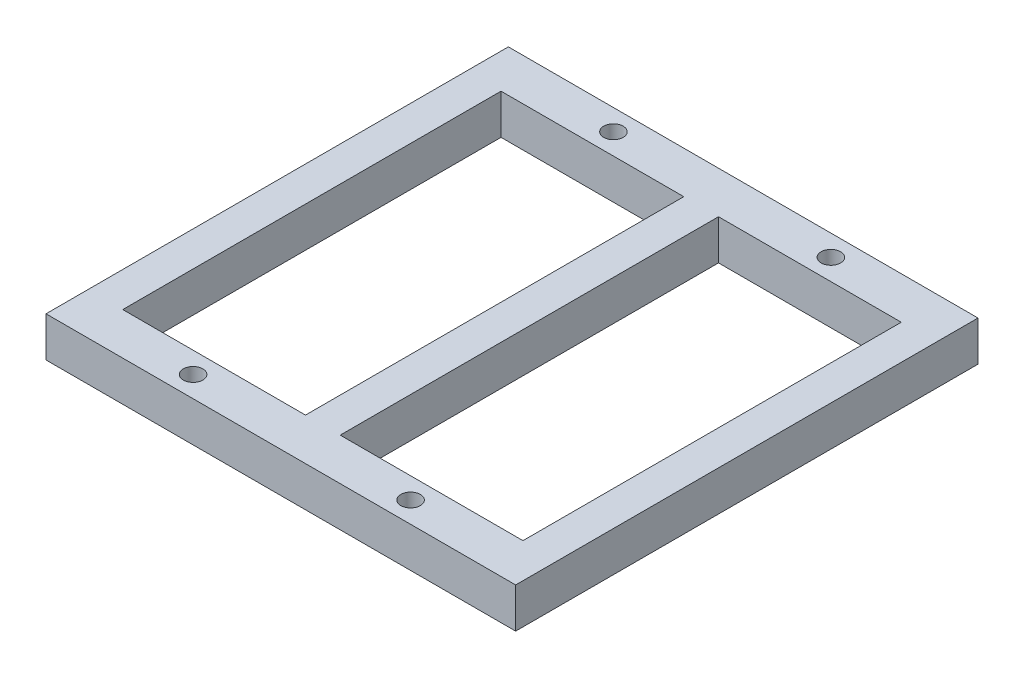
ISO-10303-21;
HEADER;
FILE_DESCRIPTION(('STEP AP214'),'2;1');
FILE_NAME('part.step','',(''),(''),'','','');
FILE_SCHEMA(('AUTOMOTIVE_DESIGN { 1 0 10303 214 1 1 1 1 }'));
ENDSEC;
DATA;
#1=APPLICATION_CONTEXT('core data for automotive mechanical design processes');
#2=APPLICATION_PROTOCOL_DEFINITION('international standard','automotive_design',2000,#1);
#3=PRODUCT_CONTEXT('',#1,'mechanical');
#4=PRODUCT('Part','Part','',(#3));
#5=PRODUCT_RELATED_PRODUCT_CATEGORY('part','',(#4));
#6=PRODUCT_DEFINITION_FORMATION('','',#4);
#7=PRODUCT_DEFINITION_CONTEXT('part definition',#1,'design');
#8=PRODUCT_DEFINITION('design','',#6,#7);
#9=PRODUCT_DEFINITION_SHAPE('','',#8);
#10=(LENGTH_UNIT() NAMED_UNIT(*) SI_UNIT(.MILLI.,.METRE.));
#11=(NAMED_UNIT(*) PLANE_ANGLE_UNIT() SI_UNIT($,.RADIAN.));
#12=(NAMED_UNIT(*) SI_UNIT($,.STERADIAN.) SOLID_ANGLE_UNIT());
#13=UNCERTAINTY_MEASURE_WITH_UNIT(LENGTH_MEASURE(1.E-05),#10,'distance_accuracy_value','');
#14=(GEOMETRIC_REPRESENTATION_CONTEXT(3) GLOBAL_UNCERTAINTY_ASSIGNED_CONTEXT((#13)) GLOBAL_UNIT_ASSIGNED_CONTEXT((#10,
#11,#12)) REPRESENTATION_CONTEXT('',''));
#15=CARTESIAN_POINT('',(0.,0.,0.));
#16=DIRECTION('',(0.,0.,1.));
#17=DIRECTION('',(1.,0.,0.));
#18=AXIS2_PLACEMENT_3D('',#15,#16,#17);
#19=CARTESIAN_POINT('',(-51.9049,6.0452,-34.925));
#20=DIRECTION('',(0.,1.,0.));
#21=DIRECTION('',(0.,0.,1.));
#22=AXIS2_PLACEMENT_3D('',#19,#20,#21);
#23=PLANE('',#22);
#24=CARTESIAN_POINT('',(-32.8549,6.0452,-31.75));
#25=DIRECTION('',(0.,1.,0.));
#26=DIRECTION('',(0.,0.,1.));
#27=AXIS2_PLACEMENT_3D('',#24,#25,#26);
#28=CIRCLE('',#27,1.47319999999999);
#29=CARTESIAN_POINT('',(-32.8549,6.0452,-30.2768));
#30=VERTEX_POINT('',#29);
#31=EDGE_CURVE('E305',#30,#30,#28,.T.);
#32=ORIENTED_EDGE('',*,*,#31,.F.);
#33=EDGE_LOOP('',(#32));
#34=FACE_BOUND('',#33,.T.);
#35=DIRECTION('',(-1.,0.,0.));
#36=VECTOR('',#35,1.);
#37=CARTESIAN_POINT('',(-46.6598,6.0452,-28.575));
#38=LINE('',#37,#36);
#39=CARTESIAN_POINT('',(-19.05,6.0452,-28.575));
#40=VERTEX_POINT('',#39);
#41=CARTESIAN_POINT('',(-46.6598,6.0452,-28.575));
#42=VERTEX_POINT('',#41);
#43=EDGE_CURVE('E149',#40,#42,#38,.T.);
#44=ORIENTED_EDGE('',*,*,#43,.F.);
#45=DIRECTION('',(0.,0.,-1.));
#46=VECTOR('',#45,1.);
#47=CARTESIAN_POINT('',(-19.05,6.0452,-28.575));
#48=LINE('',#47,#46);
#49=CARTESIAN_POINT('',(-19.05,6.0452,28.575));
#50=VERTEX_POINT('',#49);
#51=EDGE_CURVE('E140',#50,#40,#48,.T.);
#52=ORIENTED_EDGE('',*,*,#51,.F.);
#53=DIRECTION('',(1.,0.,0.));
#54=VECTOR('',#53,1.);
#55=CARTESIAN_POINT('',(-46.6598,6.0452,28.575));
#56=LINE('',#55,#54);
#57=CARTESIAN_POINT('',(-46.6598,6.0452,28.575));
#58=VERTEX_POINT('',#57);
#59=EDGE_CURVE('E169',#58,#50,#56,.T.);
#60=ORIENTED_EDGE('',*,*,#59,.F.);
#61=DIRECTION('',(0.,0.,1.));
#62=VECTOR('',#61,1.);
#63=CARTESIAN_POINT('',(-46.6598,6.0452,-28.575));
#64=LINE('',#63,#62);
#65=EDGE_CURVE('E163',#42,#58,#64,.T.);
#66=ORIENTED_EDGE('',*,*,#65,.F.);
#67=EDGE_LOOP('',(#44,#52,#60,#66));
#68=FACE_BOUND('',#67,.T.);
#69=DIRECTION('',(-1.,0.,0.));
#70=VECTOR('',#69,1.);
#71=CARTESIAN_POINT('',(-13.8049,6.0452,-28.575));
#72=LINE('',#71,#70);
#73=CARTESIAN_POINT('',(13.8049,6.0452,-28.575));
#74=VERTEX_POINT('',#73);
#75=CARTESIAN_POINT('',(-13.8049,6.0452,-28.575));
#76=VERTEX_POINT('',#75);
#77=EDGE_CURVE('E196',#74,#76,#72,.T.);
#78=ORIENTED_EDGE('',*,*,#77,.F.);
#79=DIRECTION('',(0.,0.,-1.));
#80=VECTOR('',#79,1.);
#81=CARTESIAN_POINT('',(13.8049,6.0452,-28.575));
#82=LINE('',#81,#80);
#83=CARTESIAN_POINT('',(13.8049,6.0452,28.575));
#84=VERTEX_POINT('',#83);
#85=EDGE_CURVE('E193',#84,#74,#82,.T.);
#86=ORIENTED_EDGE('',*,*,#85,.F.);
#87=DIRECTION('',(1.,0.,0.));
#88=VECTOR('',#87,1.);
#89=CARTESIAN_POINT('',(-13.8049,6.0452,28.575));
#90=LINE('',#89,#88);
#91=CARTESIAN_POINT('',(-13.8049,6.0452,28.575));
#92=VERTEX_POINT('',#91);
#93=EDGE_CURVE('E204',#92,#84,#90,.T.);
#94=ORIENTED_EDGE('',*,*,#93,.F.);
#95=DIRECTION('',(0.,0.,1.));
#96=VECTOR('',#95,1.);
#97=CARTESIAN_POINT('',(-13.8049,6.0452,-28.575));
#98=LINE('',#97,#96);
#99=EDGE_CURVE('E200',#76,#92,#98,.T.);
#100=ORIENTED_EDGE('',*,*,#99,.F.);
#101=EDGE_LOOP('',(#78,#86,#94,#100));
#102=FACE_BOUND('',#101,.T.);
#103=DIRECTION('',(-1.,0.,0.));
#104=VECTOR('',#103,1.);
#105=CARTESIAN_POINT('',(-19.05,6.0452,-34.925));
#106=LINE('',#105,#104);
#107=CARTESIAN_POINT('',(19.05,6.0452,-34.925));
#108=VERTEX_POINT('',#107);
#109=CARTESIAN_POINT('',(-51.9049,6.0452,-34.925));
#110=VERTEX_POINT('',#109);
#111=EDGE_CURVE('E235',#108,#110,#106,.T.);
#112=ORIENTED_EDGE('',*,*,#111,.T.);
#113=DIRECTION('',(0.,0.,1.));
#114=VECTOR('',#113,1.);
#115=CARTESIAN_POINT('',(-51.9049,6.0452,-34.925));
#116=LINE('',#115,#114);
#117=CARTESIAN_POINT('',(-51.9049,6.0452,34.925));
#118=VERTEX_POINT('',#117);
#119=EDGE_CURVE('E239',#110,#118,#116,.T.);
#120=ORIENTED_EDGE('',*,*,#119,.T.);
#121=DIRECTION('',(1.,0.,0.));
#122=VECTOR('',#121,1.);
#123=CARTESIAN_POINT('',(-51.9049,6.0452,34.925));
#124=LINE('',#123,#122);
#125=CARTESIAN_POINT('',(19.05,6.0452,34.925));
#126=VERTEX_POINT('',#125);
#127=EDGE_CURVE('E243',#118,#126,#124,.T.);
#128=ORIENTED_EDGE('',*,*,#127,.T.);
#129=DIRECTION('',(0.,0.,-1.));
#130=VECTOR('',#129,1.);
#131=CARTESIAN_POINT('',(19.05,6.0452,-34.925));
#132=LINE('',#131,#130);
#133=EDGE_CURVE('E246',#126,#108,#132,.T.);
#134=ORIENTED_EDGE('',*,*,#133,.T.);
#135=EDGE_LOOP('',(#112,#120,#128,#134));
#136=FACE_BOUND('',#135,.T.);
#137=CARTESIAN_POINT('',(0.,6.0452,-31.75));
#138=DIRECTION('',(0.,1.,0.));
#139=DIRECTION('',(0.,0.,-1.));
#140=AXIS2_PLACEMENT_3D('',#137,#138,#139);
#141=CIRCLE('',#140,1.4732);
#142=CARTESIAN_POINT('',(0.,6.0452,-33.2232));
#143=VERTEX_POINT('',#142);
#144=EDGE_CURVE('E187',#143,#143,#141,.T.);
#145=ORIENTED_EDGE('',*,*,#144,.F.);
#146=EDGE_LOOP('',(#145));
#147=FACE_BOUND('',#146,.T.);
#148=CARTESIAN_POINT('',(0.,6.0452,31.75));
#149=DIRECTION('',(0.,1.,0.));
#150=DIRECTION('',(0.,0.,1.));
#151=AXIS2_PLACEMENT_3D('',#148,#149,#150);
#152=CIRCLE('',#151,1.47319999999999);
#153=CARTESIAN_POINT('',(0.,6.0452,33.2232));
#154=VERTEX_POINT('',#153);
#155=EDGE_CURVE('E176',#154,#154,#152,.T.);
#156=ORIENTED_EDGE('',*,*,#155,.F.);
#157=EDGE_LOOP('',(#156));
#158=FACE_BOUND('',#157,.T.);
#159=CARTESIAN_POINT('',(-32.8549,6.0452,31.75));
#160=DIRECTION('',(0.,1.,0.));
#161=DIRECTION('',(0.,0.,-1.));
#162=AXIS2_PLACEMENT_3D('',#159,#160,#161);
#163=CIRCLE('',#162,1.47319999999999);
#164=CARTESIAN_POINT('',(-32.8549,6.0452,30.2768));
#165=VERTEX_POINT('',#164);
#166=EDGE_CURVE('E298',#165,#165,#163,.T.);
#167=ORIENTED_EDGE('',*,*,#166,.F.);
#168=EDGE_LOOP('',(#167));
#169=FACE_BOUND('',#168,.T.);
#170=ADVANCED_FACE('F39',(#34,#68,#102,#136,#147,#158,#169),#23,.T.);
#171=CARTESIAN_POINT('',(-51.9049,0.,-34.925));
#172=DIRECTION('',(0.,1.,0.));
#173=DIRECTION('',(0.,0.,1.));
#174=AXIS2_PLACEMENT_3D('',#171,#172,#173);
#175=PLANE('',#174);
#176=CARTESIAN_POINT('',(-32.8549,0.,-31.75));
#177=DIRECTION('',(0.,1.,0.));
#178=DIRECTION('',(0.,0.,1.));
#179=AXIS2_PLACEMENT_3D('',#176,#177,#178);
#180=CIRCLE('',#179,1.47319999999999);
#181=CARTESIAN_POINT('',(-32.8549,0.,-30.2768));
#182=VERTEX_POINT('',#181);
#183=EDGE_CURVE('E300',#182,#182,#180,.T.);
#184=ORIENTED_EDGE('',*,*,#183,.T.);
#185=EDGE_LOOP('',(#184));
#186=FACE_BOUND('',#185,.T.);
#187=DIRECTION('',(0.,0.,-1.));
#188=VECTOR('',#187,1.);
#189=CARTESIAN_POINT('',(-19.05,0.,-28.575));
#190=LINE('',#189,#188);
#191=CARTESIAN_POINT('',(-19.05,0.,28.575));
#192=VERTEX_POINT('',#191);
#193=CARTESIAN_POINT('',(-19.05,0.,-28.575));
#194=VERTEX_POINT('',#193);
#195=EDGE_CURVE('E63',#192,#194,#190,.T.);
#196=ORIENTED_EDGE('',*,*,#195,.T.);
#197=DIRECTION('',(-1.,0.,0.));
#198=VECTOR('',#197,1.);
#199=CARTESIAN_POINT('',(-46.6598,0.,-28.575));
#200=LINE('',#199,#198);
#201=CARTESIAN_POINT('',(-46.6598,0.,-28.575));
#202=VERTEX_POINT('',#201);
#203=EDGE_CURVE('E156',#194,#202,#200,.T.);
#204=ORIENTED_EDGE('',*,*,#203,.T.);
#205=DIRECTION('',(0.,0.,1.));
#206=VECTOR('',#205,1.);
#207=CARTESIAN_POINT('',(-46.6598,0.,-28.575));
#208=LINE('',#207,#206);
#209=CARTESIAN_POINT('',(-46.6598,0.,28.575));
#210=VERTEX_POINT('',#209);
#211=EDGE_CURVE('E178',#202,#210,#208,.T.);
#212=ORIENTED_EDGE('',*,*,#211,.T.);
#213=DIRECTION('',(1.,0.,0.));
#214=VECTOR('',#213,1.);
#215=CARTESIAN_POINT('',(-46.6598,0.,28.575));
#216=LINE('',#215,#214);
#217=EDGE_CURVE('E150',#210,#192,#216,.T.);
#218=ORIENTED_EDGE('',*,*,#217,.T.);
#219=EDGE_LOOP('',(#196,#204,#212,#218));
#220=FACE_BOUND('',#219,.T.);
#221=DIRECTION('',(0.,0.,-1.));
#222=VECTOR('',#221,1.);
#223=CARTESIAN_POINT('',(13.8049,0.,-28.575));
#224=LINE('',#223,#222);
#225=CARTESIAN_POINT('',(13.8049,0.,28.575));
#226=VERTEX_POINT('',#225);
#227=CARTESIAN_POINT('',(13.8049,0.,-28.575));
#228=VERTEX_POINT('',#227);
#229=EDGE_CURVE('E190',#226,#228,#224,.T.);
#230=ORIENTED_EDGE('',*,*,#229,.T.);
#231=DIRECTION('',(-1.,0.,0.));
#232=VECTOR('',#231,1.);
#233=CARTESIAN_POINT('',(-13.8049,0.,-28.575));
#234=LINE('',#233,#232);
#235=CARTESIAN_POINT('',(-13.8049,0.,-28.575));
#236=VERTEX_POINT('',#235);
#237=EDGE_CURVE('E211',#228,#236,#234,.T.);
#238=ORIENTED_EDGE('',*,*,#237,.T.);
#239=DIRECTION('',(0.,0.,1.));
#240=VECTOR('',#239,1.);
#241=CARTESIAN_POINT('',(-13.8049,0.,-28.575));
#242=LINE('',#241,#240);
#243=CARTESIAN_POINT('',(-13.8049,0.,28.575));
#244=VERTEX_POINT('',#243);
#245=EDGE_CURVE('E215',#236,#244,#242,.T.);
#246=ORIENTED_EDGE('',*,*,#245,.T.);
#247=DIRECTION('',(1.,0.,0.));
#248=VECTOR('',#247,1.);
#249=CARTESIAN_POINT('',(-13.8049,0.,28.575));
#250=LINE('',#249,#248);
#251=EDGE_CURVE('E197',#244,#226,#250,.T.);
#252=ORIENTED_EDGE('',*,*,#251,.T.);
#253=EDGE_LOOP('',(#230,#238,#246,#252));
#254=FACE_BOUND('',#253,.T.);
#255=DIRECTION('',(0.,0.,1.));
#256=VECTOR('',#255,1.);
#257=CARTESIAN_POINT('',(-51.9049,0.,-34.925));
#258=LINE('',#257,#256);
#259=CARTESIAN_POINT('',(-51.9049,0.,-34.925));
#260=VERTEX_POINT('',#259);
#261=CARTESIAN_POINT('',(-51.9049,0.,34.925));
#262=VERTEX_POINT('',#261);
#263=EDGE_CURVE('E234',#260,#262,#258,.T.);
#264=ORIENTED_EDGE('',*,*,#263,.F.);
#265=DIRECTION('',(-1.,0.,0.));
#266=VECTOR('',#265,1.);
#267=CARTESIAN_POINT('',(-19.05,0.,-34.925));
#268=LINE('',#267,#266);
#269=CARTESIAN_POINT('',(19.05,0.,-34.925));
#270=VERTEX_POINT('',#269);
#271=EDGE_CURVE('E240',#270,#260,#268,.T.);
#272=ORIENTED_EDGE('',*,*,#271,.F.);
#273=DIRECTION('',(0.,0.,-1.));
#274=VECTOR('',#273,1.);
#275=CARTESIAN_POINT('',(19.05,0.,-34.925));
#276=LINE('',#275,#274);
#277=CARTESIAN_POINT('',(19.05,0.,34.925));
#278=VERTEX_POINT('',#277);
#279=EDGE_CURVE('E256',#278,#270,#276,.T.);
#280=ORIENTED_EDGE('',*,*,#279,.F.);
#281=DIRECTION('',(1.,0.,0.));
#282=VECTOR('',#281,1.);
#283=CARTESIAN_POINT('',(-19.05,0.,34.925));
#284=LINE('',#283,#282);
#285=EDGE_CURVE('E254',#262,#278,#284,.T.);
#286=ORIENTED_EDGE('',*,*,#285,.F.);
#287=EDGE_LOOP('',(#264,#272,#280,#286));
#288=FACE_BOUND('',#287,.T.);
#289=CARTESIAN_POINT('',(0.,0.,-31.75));
#290=DIRECTION('',(0.,1.,0.));
#291=DIRECTION('',(0.,0.,-1.));
#292=AXIS2_PLACEMENT_3D('',#289,#290,#291);
#293=CIRCLE('',#292,1.4732);
#294=CARTESIAN_POINT('',(0.,0.,-33.2232));
#295=VERTEX_POINT('',#294);
#296=EDGE_CURVE('E158',#295,#295,#293,.T.);
#297=ORIENTED_EDGE('',*,*,#296,.T.);
#298=EDGE_LOOP('',(#297));
#299=FACE_BOUND('',#298,.T.);
#300=CARTESIAN_POINT('',(0.,0.,31.75));
#301=DIRECTION('',(0.,1.,0.));
#302=DIRECTION('',(0.,0.,1.));
#303=AXIS2_PLACEMENT_3D('',#300,#301,#302);
#304=CIRCLE('',#303,1.47319999999999);
#305=CARTESIAN_POINT('',(0.,0.,33.2232));
#306=VERTEX_POINT('',#305);
#307=EDGE_CURVE('E312',#306,#306,#304,.T.);
#308=ORIENTED_EDGE('',*,*,#307,.T.);
#309=EDGE_LOOP('',(#308));
#310=FACE_BOUND('',#309,.T.);
#311=CARTESIAN_POINT('',(-32.8549,0.,31.75));
#312=DIRECTION('',(0.,1.,0.));
#313=DIRECTION('',(0.,0.,-1.));
#314=AXIS2_PLACEMENT_3D('',#311,#312,#313);
#315=CIRCLE('',#314,1.47319999999999);
#316=CARTESIAN_POINT('',(-32.8549,0.,30.2768));
#317=VERTEX_POINT('',#316);
#318=EDGE_CURVE('E301',#317,#317,#315,.T.);
#319=ORIENTED_EDGE('',*,*,#318,.T.);
#320=EDGE_LOOP('',(#319));
#321=FACE_BOUND('',#320,.T.);
#322=ADVANCED_FACE('F277',(#186,#220,#254,#288,#299,#310,#321),#175,.F.);
#323=CARTESIAN_POINT('',(-51.9049,6.0452,-34.925));
#324=DIRECTION('',(1.,0.,0.));
#325=DIRECTION('',(0.,0.,-1.));
#326=AXIS2_PLACEMENT_3D('',#323,#324,#325);
#327=PLANE('',#326);
#328=ORIENTED_EDGE('',*,*,#263,.T.);
#329=DIRECTION('',(0.,-1.,0.));
#330=VECTOR('',#329,1.);
#331=CARTESIAN_POINT('',(-51.9049,6.0452,34.925));
#332=LINE('',#331,#330);
#333=EDGE_CURVE('E48',#118,#262,#332,.T.);
#334=ORIENTED_EDGE('',*,*,#333,.F.);
#335=ORIENTED_EDGE('',*,*,#119,.F.);
#336=DIRECTION('',(0.,-1.,0.));
#337=VECTOR('',#336,1.);
#338=CARTESIAN_POINT('',(-51.9049,6.0452,-34.925));
#339=LINE('',#338,#337);
#340=EDGE_CURVE('E11',#110,#260,#339,.T.);
#341=ORIENTED_EDGE('',*,*,#340,.T.);
#342=EDGE_LOOP('',(#328,#334,#335,#341));
#343=FACE_BOUND('',#342,.T.);
#344=ADVANCED_FACE('F41',(#343),#327,.F.);
#345=CARTESIAN_POINT('',(-19.05,6.0452,34.925));
#346=DIRECTION('',(0.,0.,-1.));
#347=DIRECTION('',(-1.,0.,0.));
#348=AXIS2_PLACEMENT_3D('',#345,#346,#347);
#349=PLANE('',#348);
#350=ORIENTED_EDGE('',*,*,#285,.T.);
#351=DIRECTION('',(0.,-1.,0.));
#352=VECTOR('',#351,1.);
#353=CARTESIAN_POINT('',(19.05,6.0452,34.925));
#354=LINE('',#353,#352);
#355=EDGE_CURVE('E264',#126,#278,#354,.T.);
#356=ORIENTED_EDGE('',*,*,#355,.F.);
#357=ORIENTED_EDGE('',*,*,#127,.F.);
#358=ORIENTED_EDGE('',*,*,#333,.T.);
#359=EDGE_LOOP('',(#350,#356,#357,#358));
#360=FACE_BOUND('',#359,.T.);
#361=ADVANCED_FACE('F270',(#360),#349,.F.);
#362=CARTESIAN_POINT('',(19.05,6.0452,-34.925));
#363=DIRECTION('',(-1.,0.,0.));
#364=DIRECTION('',(0.,0.,1.));
#365=AXIS2_PLACEMENT_3D('',#362,#363,#364);
#366=PLANE('',#365);
#367=ORIENTED_EDGE('',*,*,#279,.T.);
#368=DIRECTION('',(0.,-1.,0.));
#369=VECTOR('',#368,1.);
#370=CARTESIAN_POINT('',(19.05,6.0452,-34.925));
#371=LINE('',#370,#369);
#372=EDGE_CURVE('E250',#108,#270,#371,.T.);
#373=ORIENTED_EDGE('',*,*,#372,.F.);
#374=ORIENTED_EDGE('',*,*,#133,.F.);
#375=ORIENTED_EDGE('',*,*,#355,.T.);
#376=EDGE_LOOP('',(#367,#373,#374,#375));
#377=FACE_BOUND('',#376,.T.);
#378=ADVANCED_FACE('F282',(#377),#366,.F.);
#379=CARTESIAN_POINT('',(-19.05,6.0452,-34.925));
#380=DIRECTION('',(0.,0.,1.));
#381=DIRECTION('',(1.,0.,0.));
#382=AXIS2_PLACEMENT_3D('',#379,#380,#381);
#383=PLANE('',#382);
#384=ORIENTED_EDGE('',*,*,#271,.T.);
#385=ORIENTED_EDGE('',*,*,#340,.F.);
#386=ORIENTED_EDGE('',*,*,#111,.F.);
#387=ORIENTED_EDGE('',*,*,#372,.T.);
#388=EDGE_LOOP('',(#384,#385,#386,#387));
#389=FACE_BOUND('',#388,.T.);
#390=ADVANCED_FACE('F285',(#389),#383,.F.);
#391=CARTESIAN_POINT('',(13.8049,6.0452,-28.575));
#392=DIRECTION('',(-1.,0.,0.));
#393=DIRECTION('',(0.,0.,1.));
#394=AXIS2_PLACEMENT_3D('',#391,#392,#393);
#395=PLANE('',#394);
#396=ORIENTED_EDGE('',*,*,#229,.F.);
#397=DIRECTION('',(0.,-1.,0.));
#398=VECTOR('',#397,1.);
#399=CARTESIAN_POINT('',(13.8049,6.0452,28.575));
#400=LINE('',#399,#398);
#401=EDGE_CURVE('E207',#84,#226,#400,.T.);
#402=ORIENTED_EDGE('',*,*,#401,.F.);
#403=ORIENTED_EDGE('',*,*,#85,.T.);
#404=DIRECTION('',(0.,-1.,0.));
#405=VECTOR('',#404,1.);
#406=CARTESIAN_POINT('',(13.8049,6.0452,-28.575));
#407=LINE('',#406,#405);
#408=EDGE_CURVE('E230',#74,#228,#407,.T.);
#409=ORIENTED_EDGE('',*,*,#408,.T.);
#410=EDGE_LOOP('',(#396,#402,#403,#409));
#411=FACE_BOUND('',#410,.T.);
#412=ADVANCED_FACE('F359',(#411),#395,.T.);
#413=CARTESIAN_POINT('',(-13.8049,6.0452,-28.575));
#414=DIRECTION('',(0.,0.,1.));
#415=DIRECTION('',(1.,0.,0.));
#416=AXIS2_PLACEMENT_3D('',#413,#414,#415);
#417=PLANE('',#416);
#418=ORIENTED_EDGE('',*,*,#237,.F.);
#419=ORIENTED_EDGE('',*,*,#408,.F.);
#420=ORIENTED_EDGE('',*,*,#77,.T.);
#421=DIRECTION('',(0.,-1.,0.));
#422=VECTOR('',#421,1.);
#423=CARTESIAN_POINT('',(-13.8049,6.0452,-28.575));
#424=LINE('',#423,#422);
#425=EDGE_CURVE('E227',#76,#236,#424,.T.);
#426=ORIENTED_EDGE('',*,*,#425,.T.);
#427=EDGE_LOOP('',(#418,#419,#420,#426));
#428=FACE_BOUND('',#427,.T.);
#429=ADVANCED_FACE('F355',(#428),#417,.T.);
#430=CARTESIAN_POINT('',(-13.8049,6.0452,-28.575));
#431=DIRECTION('',(1.,0.,0.));
#432=DIRECTION('',(0.,0.,-1.));
#433=AXIS2_PLACEMENT_3D('',#430,#431,#432);
#434=PLANE('',#433);
#435=ORIENTED_EDGE('',*,*,#245,.F.);
#436=ORIENTED_EDGE('',*,*,#425,.F.);
#437=ORIENTED_EDGE('',*,*,#99,.T.);
#438=DIRECTION('',(0.,-1.,0.));
#439=VECTOR('',#438,1.);
#440=CARTESIAN_POINT('',(-13.8049,6.0452,28.575));
#441=LINE('',#440,#439);
#442=EDGE_CURVE('E224',#92,#244,#441,.T.);
#443=ORIENTED_EDGE('',*,*,#442,.T.);
#444=EDGE_LOOP('',(#435,#436,#437,#443));
#445=FACE_BOUND('',#444,.T.);
#446=ADVANCED_FACE('F351',(#445),#434,.T.);
#447=CARTESIAN_POINT('',(-13.8049,6.0452,28.575));
#448=DIRECTION('',(0.,0.,-1.));
#449=DIRECTION('',(-1.,0.,0.));
#450=AXIS2_PLACEMENT_3D('',#447,#448,#449);
#451=PLANE('',#450);
#452=ORIENTED_EDGE('',*,*,#251,.F.);
#453=ORIENTED_EDGE('',*,*,#442,.F.);
#454=ORIENTED_EDGE('',*,*,#93,.T.);
#455=ORIENTED_EDGE('',*,*,#401,.T.);
#456=EDGE_LOOP('',(#452,#453,#454,#455));
#457=FACE_BOUND('',#456,.T.);
#458=ADVANCED_FACE('F347',(#457),#451,.T.);
#459=CARTESIAN_POINT('',(0.,6.0452,-31.75));
#460=DIRECTION('',(0.,-1.,0.));
#461=DIRECTION('',(0.,0.,-1.));
#462=AXIS2_PLACEMENT_3D('',#459,#460,#461);
#463=CYLINDRICAL_SURFACE('',#462,1.4732);
#464=ORIENTED_EDGE('',*,*,#144,.T.);
#465=EDGE_LOOP('',(#464));
#466=FACE_BOUND('',#465,.T.);
#467=ORIENTED_EDGE('',*,*,#296,.F.);
#468=EDGE_LOOP('',(#467));
#469=FACE_BOUND('',#468,.T.);
#470=ADVANCED_FACE('F344',(#466,#469),#463,.F.);
#471=CARTESIAN_POINT('',(-19.05,6.0452,-28.575));
#472=DIRECTION('',(-1.,0.,0.));
#473=DIRECTION('',(0.,0.,1.));
#474=AXIS2_PLACEMENT_3D('',#471,#472,#473);
#475=PLANE('',#474);
#476=ORIENTED_EDGE('',*,*,#195,.F.);
#477=DIRECTION('',(0.,-1.,0.));
#478=VECTOR('',#477,1.);
#479=CARTESIAN_POINT('',(-19.05,6.0452,28.575));
#480=LINE('',#479,#478);
#481=EDGE_CURVE('E144',#50,#192,#480,.T.);
#482=ORIENTED_EDGE('',*,*,#481,.F.);
#483=ORIENTED_EDGE('',*,*,#51,.T.);
#484=DIRECTION('',(0.,-1.,0.));
#485=VECTOR('',#484,1.);
#486=CARTESIAN_POINT('',(-19.05,6.0452,-28.575));
#487=LINE('',#486,#485);
#488=EDGE_CURVE('E143',#40,#194,#487,.T.);
#489=ORIENTED_EDGE('',*,*,#488,.T.);
#490=EDGE_LOOP('',(#476,#482,#483,#489));
#491=FACE_BOUND('',#490,.T.);
#492=ADVANCED_FACE('F142',(#491),#475,.T.);
#493=CARTESIAN_POINT('',(-46.6598,6.0452,-28.575));
#494=DIRECTION('',(0.,0.,1.));
#495=DIRECTION('',(1.,0.,0.));
#496=AXIS2_PLACEMENT_3D('',#493,#494,#495);
#497=PLANE('',#496);
#498=ORIENTED_EDGE('',*,*,#203,.F.);
#499=ORIENTED_EDGE('',*,*,#488,.F.);
#500=ORIENTED_EDGE('',*,*,#43,.T.);
#501=DIRECTION('',(0.,-1.,0.));
#502=VECTOR('',#501,1.);
#503=CARTESIAN_POINT('',(-46.6598,6.0452,-28.575));
#504=LINE('',#503,#502);
#505=EDGE_CURVE('E159',#42,#202,#504,.T.);
#506=ORIENTED_EDGE('',*,*,#505,.T.);
#507=EDGE_LOOP('',(#498,#499,#500,#506));
#508=FACE_BOUND('',#507,.T.);
#509=ADVANCED_FACE('F153',(#508),#497,.T.);
#510=CARTESIAN_POINT('',(-46.6598,6.0452,-28.575));
#511=DIRECTION('',(1.,0.,0.));
#512=DIRECTION('',(0.,0.,-1.));
#513=AXIS2_PLACEMENT_3D('',#510,#511,#512);
#514=PLANE('',#513);
#515=ORIENTED_EDGE('',*,*,#211,.F.);
#516=ORIENTED_EDGE('',*,*,#505,.F.);
#517=ORIENTED_EDGE('',*,*,#65,.T.);
#518=DIRECTION('',(0.,-1.,0.));
#519=VECTOR('',#518,1.);
#520=CARTESIAN_POINT('',(-46.6598,6.0452,28.575));
#521=LINE('',#520,#519);
#522=EDGE_CURVE('E55',#58,#210,#521,.T.);
#523=ORIENTED_EDGE('',*,*,#522,.T.);
#524=EDGE_LOOP('',(#515,#516,#517,#523));
#525=FACE_BOUND('',#524,.T.);
#526=ADVANCED_FACE('F333',(#525),#514,.T.);
#527=CARTESIAN_POINT('',(-46.6598,6.0452,28.575));
#528=DIRECTION('',(0.,0.,-1.));
#529=DIRECTION('',(-1.,0.,0.));
#530=AXIS2_PLACEMENT_3D('',#527,#528,#529);
#531=PLANE('',#530);
#532=ORIENTED_EDGE('',*,*,#217,.F.);
#533=ORIENTED_EDGE('',*,*,#522,.F.);
#534=ORIENTED_EDGE('',*,*,#59,.T.);
#535=ORIENTED_EDGE('',*,*,#481,.T.);
#536=EDGE_LOOP('',(#532,#533,#534,#535));
#537=FACE_BOUND('',#536,.T.);
#538=ADVANCED_FACE('F323',(#537),#531,.T.);
#539=CARTESIAN_POINT('',(0.,6.0452,31.75));
#540=DIRECTION('',(0.,-1.,0.));
#541=DIRECTION('',(0.,0.,-1.));
#542=AXIS2_PLACEMENT_3D('',#539,#540,#541);
#543=CYLINDRICAL_SURFACE('',#542,1.47319999999999);
#544=ORIENTED_EDGE('',*,*,#155,.T.);
#545=EDGE_LOOP('',(#544));
#546=FACE_BOUND('',#545,.T.);
#547=ORIENTED_EDGE('',*,*,#307,.F.);
#548=EDGE_LOOP('',(#547));
#549=FACE_BOUND('',#548,.T.);
#550=ADVANCED_FACE('F320',(#546,#549),#543,.F.);
#551=CARTESIAN_POINT('',(-32.8549,6.0452,-31.75));
#552=DIRECTION('',(0.,-1.,0.));
#553=DIRECTION('',(0.,0.,-1.));
#554=AXIS2_PLACEMENT_3D('',#551,#552,#553);
#555=CYLINDRICAL_SURFACE('',#554,1.47319999999999);
#556=ORIENTED_EDGE('',*,*,#31,.T.);
#557=EDGE_LOOP('',(#556));
#558=FACE_BOUND('',#557,.T.);
#559=ORIENTED_EDGE('',*,*,#183,.F.);
#560=EDGE_LOOP('',(#559));
#561=FACE_BOUND('',#560,.T.);
#562=ADVANCED_FACE('F322',(#558,#561),#555,.F.);
#563=CARTESIAN_POINT('',(-32.8549,6.0452,31.75));
#564=DIRECTION('',(0.,-1.,0.));
#565=DIRECTION('',(0.,0.,-1.));
#566=AXIS2_PLACEMENT_3D('',#563,#564,#565);
#567=CYLINDRICAL_SURFACE('',#566,1.47319999999999);
#568=ORIENTED_EDGE('',*,*,#166,.T.);
#569=EDGE_LOOP('',(#568));
#570=FACE_BOUND('',#569,.T.);
#571=ORIENTED_EDGE('',*,*,#318,.F.);
#572=EDGE_LOOP('',(#571));
#573=FACE_BOUND('',#572,.T.);
#574=ADVANCED_FACE('F330',(#570,#573),#567,.F.);
#575=CLOSED_SHELL('',(#170,#322,#344,#361,#378,#390,#412,#429,#446,#458,#470,#492,#509,#526,
#538,#550,#562,#574));
#576=MANIFOLD_SOLID_BREP('B2',#575);
#577=ADVANCED_BREP_SHAPE_REPRESENTATION('',(#18,#576),#14);
#578=SHAPE_DEFINITION_REPRESENTATION(#9,#577);
ENDSEC;
END-ISO-10303-21;
